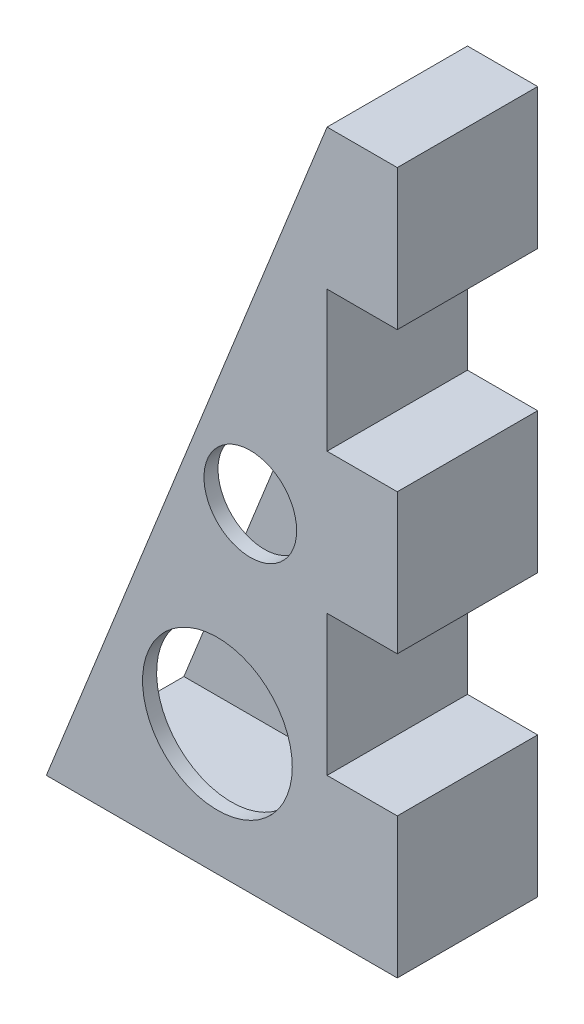
ISO-10303-21;
HEADER;
FILE_DESCRIPTION(('STEP AP214'),'2;1');
FILE_NAME('part.step','',(''),(''),'','','');
FILE_SCHEMA(('AUTOMOTIVE_DESIGN { 1 0 10303 214 1 1 1 1 }'));
ENDSEC;
DATA;
#1=APPLICATION_CONTEXT('core data for automotive mechanical design processes');
#2=APPLICATION_PROTOCOL_DEFINITION('international standard','automotive_design',2000,#1);
#3=PRODUCT_CONTEXT('',#1,'mechanical');
#4=PRODUCT('Part','Part','',(#3));
#5=PRODUCT_RELATED_PRODUCT_CATEGORY('part','',(#4));
#6=PRODUCT_DEFINITION_FORMATION('','',#4);
#7=PRODUCT_DEFINITION_CONTEXT('part definition',#1,'design');
#8=PRODUCT_DEFINITION('design','',#6,#7);
#9=PRODUCT_DEFINITION_SHAPE('','',#8);
#10=(LENGTH_UNIT() NAMED_UNIT(*) SI_UNIT(.MILLI.,.METRE.));
#11=(NAMED_UNIT(*) PLANE_ANGLE_UNIT() SI_UNIT($,.RADIAN.));
#12=(NAMED_UNIT(*) SI_UNIT($,.STERADIAN.) SOLID_ANGLE_UNIT());
#13=UNCERTAINTY_MEASURE_WITH_UNIT(LENGTH_MEASURE(1.E-05),#10,'distance_accuracy_value','');
#14=(GEOMETRIC_REPRESENTATION_CONTEXT(3) GLOBAL_UNCERTAINTY_ASSIGNED_CONTEXT((#13)) GLOBAL_UNIT_ASSIGNED_CONTEXT((#10,
#11,#12)) REPRESENTATION_CONTEXT('',''));
#15=CARTESIAN_POINT('',(0.,0.,0.));
#16=DIRECTION('',(0.,0.,1.));
#17=DIRECTION('',(1.,0.,0.));
#18=AXIS2_PLACEMENT_3D('',#15,#16,#17);
#19=CARTESIAN_POINT('',(15.8747982714616,-6.34991930858462,-10.));
#20=DIRECTION('',(-0.928476690885259,0.371390676354104,0.));
#21=DIRECTION('',(-0.371390676354104,-0.928476690885259,0.));
#22=AXIS2_PLACEMENT_3D('',#19,#20,#21);
#23=PLANE('',#22);
#24=DIRECTION('',(-0.371390676354104,-0.928476690885259,0.));
#25=VECTOR('',#24,1.);
#26=CARTESIAN_POINT('',(15.8747982714616,-6.34991930858462,0.));
#27=LINE('',#26,#25);
#28=CARTESIAN_POINT('',(38.4147659948954,50.,0.));
#29=VERTEX_POINT('',#28);
#30=CARTESIAN_POINT('',(18.4147659948954,0.,0.));
#31=VERTEX_POINT('',#30);
#32=EDGE_CURVE('E183',#29,#31,#27,.T.);
#33=ORIENTED_EDGE('',*,*,#32,.F.);
#34=DIRECTION('',(0.,0.,1.));
#35=VECTOR('',#34,1.);
#36=CARTESIAN_POINT('',(38.4147659948954,50.,-10.));
#37=LINE('',#36,#35);
#38=CARTESIAN_POINT('',(38.4147659948954,50.,-10.));
#39=VERTEX_POINT('',#38);
#40=EDGE_CURVE('E119',#39,#29,#37,.T.);
#41=ORIENTED_EDGE('',*,*,#40,.F.);
#42=DIRECTION('',(-0.371390676354104,-0.928476690885259,0.));
#43=VECTOR('',#42,1.);
#44=CARTESIAN_POINT('',(15.8747982714616,-6.34991930858462,-10.));
#45=LINE('',#44,#43);
#46=CARTESIAN_POINT('',(18.4147659948954,0.,-10.));
#47=VERTEX_POINT('',#46);
#48=EDGE_CURVE('E277',#39,#47,#45,.T.);
#49=ORIENTED_EDGE('',*,*,#48,.T.);
#50=DIRECTION('',(0.,0.,1.));
#51=VECTOR('',#50,1.);
#52=CARTESIAN_POINT('',(18.4147659948954,0.,-10.));
#53=LINE('',#52,#51);
#54=EDGE_CURVE('E230',#47,#31,#53,.T.);
#55=ORIENTED_EDGE('',*,*,#54,.T.);
#56=EDGE_LOOP('',(#33,#41,#49,#55));
#57=FACE_BOUND('',#56,.T.);
#58=DIRECTION('',(-0.371390676354104,-0.928476690885259,0.));
#59=VECTOR('',#58,1.);
#60=CARTESIAN_POINT('',(15.8747982714616,-6.34991930858462,-0.999999999999989));
#61=LINE('',#60,#59);
#62=CARTESIAN_POINT('',(36.4147659948954,45.,-0.99999999999999));
#63=VERTEX_POINT('',#62);
#64=CARTESIAN_POINT('',(19.2147659948954,2.,-0.99999999999999));
#65=VERTEX_POINT('',#64);
#66=EDGE_CURVE('E234',#63,#65,#61,.T.);
#67=ORIENTED_EDGE('',*,*,#66,.T.);
#68=DIRECTION('',(0.,0.,-1.));
#69=VECTOR('',#68,1.);
#70=CARTESIAN_POINT('',(19.2147659948954,2.,-10.));
#71=LINE('',#70,#69);
#72=CARTESIAN_POINT('',(19.2147659948954,2.,-9.00000000000001));
#73=VERTEX_POINT('',#72);
#74=EDGE_CURVE('E13',#65,#73,#71,.T.);
#75=ORIENTED_EDGE('',*,*,#74,.T.);
#76=DIRECTION('',(0.371390676354104,0.928476690885259,0.));
#77=VECTOR('',#76,1.);
#78=CARTESIAN_POINT('',(15.8747982714616,-6.34991930858462,-9.00000000000001));
#79=LINE('',#78,#77);
#80=CARTESIAN_POINT('',(36.4147659948954,45.,-9.));
#81=VERTEX_POINT('',#80);
#82=EDGE_CURVE('E51',#73,#81,#79,.T.);
#83=ORIENTED_EDGE('',*,*,#82,.T.);
#84=DIRECTION('',(0.,0.,-1.));
#85=VECTOR('',#84,1.);
#86=CARTESIAN_POINT('',(36.4147659948954,45.,-10.));
#87=LINE('',#86,#85);
#88=EDGE_CURVE('E215',#63,#81,#87,.T.);
#89=ORIENTED_EDGE('',*,*,#88,.F.);
#90=EDGE_LOOP('',(#67,#75,#83,#89));
#91=FACE_BOUND('',#90,.T.);
#92=ADVANCED_FACE('F42',(#57,#91),#23,.T.);
#93=CARTESIAN_POINT('',(0.,50.,-10.));
#94=DIRECTION('',(0.,1.,0.));
#95=DIRECTION('',(0.,0.,1.));
#96=AXIS2_PLACEMENT_3D('',#93,#94,#95);
#97=PLANE('',#96);
#98=DIRECTION('',(-1.,0.,0.));
#99=VECTOR('',#98,1.);
#100=CARTESIAN_POINT('',(0.,50.,0.));
#101=LINE('',#100,#99);
#102=CARTESIAN_POINT('',(43.4147659948954,50.,0.));
#103=VERTEX_POINT('',#102);
#104=EDGE_CURVE('E180',#103,#29,#101,.T.);
#105=ORIENTED_EDGE('',*,*,#104,.F.);
#106=DIRECTION('',(0.,0.,1.));
#107=VECTOR('',#106,1.);
#108=CARTESIAN_POINT('',(43.4147659948954,50.,-10.));
#109=LINE('',#108,#107);
#110=CARTESIAN_POINT('',(43.4147659948954,50.,-10.));
#111=VERTEX_POINT('',#110);
#112=EDGE_CURVE('E68',#111,#103,#109,.T.);
#113=ORIENTED_EDGE('',*,*,#112,.F.);
#114=DIRECTION('',(-1.,0.,0.));
#115=VECTOR('',#114,1.);
#116=CARTESIAN_POINT('',(0.,50.,-10.));
#117=LINE('',#116,#115);
#118=EDGE_CURVE('E213',#111,#39,#117,.T.);
#119=ORIENTED_EDGE('',*,*,#118,.T.);
#120=ORIENTED_EDGE('',*,*,#40,.T.);
#121=EDGE_LOOP('',(#105,#113,#119,#120));
#122=FACE_BOUND('',#121,.T.);
#123=ADVANCED_FACE('F44',(#122),#97,.T.);
#124=CARTESIAN_POINT('',(43.4147659948954,0.,-10.));
#125=DIRECTION('',(1.,0.,0.));
#126=DIRECTION('',(0.,0.,-1.));
#127=AXIS2_PLACEMENT_3D('',#124,#125,#126);
#128=PLANE('',#127);
#129=DIRECTION('',(0.,1.,0.));
#130=VECTOR('',#129,1.);
#131=CARTESIAN_POINT('',(43.4147659948954,0.,0.));
#132=LINE('',#131,#130);
#133=CARTESIAN_POINT('',(43.4147659948954,40.,0.));
#134=VERTEX_POINT('',#133);
#135=EDGE_CURVE('E210',#134,#103,#132,.T.);
#136=ORIENTED_EDGE('',*,*,#135,.F.);
#137=DIRECTION('',(0.,0.,1.));
#138=VECTOR('',#137,1.);
#139=CARTESIAN_POINT('',(43.4147659948954,40.,-10.));
#140=LINE('',#139,#138);
#141=CARTESIAN_POINT('',(43.4147659948954,40.,-10.));
#142=VERTEX_POINT('',#141);
#143=EDGE_CURVE('E161',#142,#134,#140,.T.);
#144=ORIENTED_EDGE('',*,*,#143,.F.);
#145=DIRECTION('',(0.,1.,0.));
#146=VECTOR('',#145,1.);
#147=CARTESIAN_POINT('',(43.4147659948954,0.,-10.));
#148=LINE('',#147,#146);
#149=EDGE_CURVE('E170',#142,#111,#148,.T.);
#150=ORIENTED_EDGE('',*,*,#149,.T.);
#151=ORIENTED_EDGE('',*,*,#112,.T.);
#152=EDGE_LOOP('',(#136,#144,#150,#151));
#153=FACE_BOUND('',#152,.T.);
#154=ADVANCED_FACE('F322',(#153),#128,.T.);
#155=CARTESIAN_POINT('',(0.,40.,-10.));
#156=DIRECTION('',(0.,-1.,0.));
#157=DIRECTION('',(0.,0.,-1.));
#158=AXIS2_PLACEMENT_3D('',#155,#156,#157);
#159=PLANE('',#158);
#160=DIRECTION('',(1.,0.,0.));
#161=VECTOR('',#160,1.);
#162=CARTESIAN_POINT('',(0.,40.,0.));
#163=LINE('',#162,#161);
#164=CARTESIAN_POINT('',(38.4147659948954,40.,0.));
#165=VERTEX_POINT('',#164);
#166=EDGE_CURVE('E156',#165,#134,#163,.T.);
#167=ORIENTED_EDGE('',*,*,#166,.F.);
#168=DIRECTION('',(0.,0.,1.));
#169=VECTOR('',#168,1.);
#170=CARTESIAN_POINT('',(38.4147659948954,40.,-10.));
#171=LINE('',#170,#169);
#172=CARTESIAN_POINT('',(38.4147659948954,40.,-10.));
#173=VERTEX_POINT('',#172);
#174=EDGE_CURVE('E150',#173,#165,#171,.T.);
#175=ORIENTED_EDGE('',*,*,#174,.F.);
#176=DIRECTION('',(1.,0.,0.));
#177=VECTOR('',#176,1.);
#178=CARTESIAN_POINT('',(0.,40.,-10.));
#179=LINE('',#178,#177);
#180=EDGE_CURVE('E153',#173,#142,#179,.T.);
#181=ORIENTED_EDGE('',*,*,#180,.T.);
#182=ORIENTED_EDGE('',*,*,#143,.T.);
#183=EDGE_LOOP('',(#167,#175,#181,#182));
#184=FACE_BOUND('',#183,.T.);
#185=ADVANCED_FACE('F152',(#184),#159,.T.);
#186=CARTESIAN_POINT('',(38.4147659948954,0.,-10.));
#187=DIRECTION('',(1.,0.,0.));
#188=DIRECTION('',(0.,1.,0.));
#189=AXIS2_PLACEMENT_3D('',#186,#187,#188);
#190=PLANE('',#189);
#191=DIRECTION('',(0.,1.,0.));
#192=VECTOR('',#191,1.);
#193=CARTESIAN_POINT('',(38.4147659948954,0.,0.));
#194=LINE('',#193,#192);
#195=CARTESIAN_POINT('',(38.4147659948954,30.,0.));
#196=VERTEX_POINT('',#195);
#197=EDGE_CURVE('E207',#196,#165,#194,.T.);
#198=ORIENTED_EDGE('',*,*,#197,.F.);
#199=DIRECTION('',(0.,0.,1.));
#200=VECTOR('',#199,1.);
#201=CARTESIAN_POINT('',(38.4147659948954,30.,-10.));
#202=LINE('',#201,#200);
#203=CARTESIAN_POINT('',(38.4147659948954,30.,-10.));
#204=VERTEX_POINT('',#203);
#205=EDGE_CURVE('E162',#204,#196,#202,.T.);
#206=ORIENTED_EDGE('',*,*,#205,.F.);
#207=DIRECTION('',(0.,1.,0.));
#208=VECTOR('',#207,1.);
#209=CARTESIAN_POINT('',(38.4147659948954,0.,-10.));
#210=LINE('',#209,#208);
#211=EDGE_CURVE('E168',#204,#173,#210,.T.);
#212=ORIENTED_EDGE('',*,*,#211,.T.);
#213=ORIENTED_EDGE('',*,*,#174,.T.);
#214=EDGE_LOOP('',(#198,#206,#212,#213));
#215=FACE_BOUND('',#214,.T.);
#216=ADVANCED_FACE('F172',(#215),#190,.T.);
#217=CARTESIAN_POINT('',(0.,30.,-10.));
#218=DIRECTION('',(0.,1.,0.));
#219=DIRECTION('',(0.,0.,1.));
#220=AXIS2_PLACEMENT_3D('',#217,#218,#219);
#221=PLANE('',#220);
#222=DIRECTION('',(-1.,0.,0.));
#223=VECTOR('',#222,1.);
#224=CARTESIAN_POINT('',(0.,30.,0.));
#225=LINE('',#224,#223);
#226=CARTESIAN_POINT('',(43.4147659948954,30.,0.));
#227=VERTEX_POINT('',#226);
#228=EDGE_CURVE('E204',#227,#196,#225,.T.);
#229=ORIENTED_EDGE('',*,*,#228,.F.);
#230=DIRECTION('',(0.,0.,1.));
#231=VECTOR('',#230,1.);
#232=CARTESIAN_POINT('',(43.4147659948954,30.,-10.));
#233=LINE('',#232,#231);
#234=CARTESIAN_POINT('',(43.4147659948954,30.,-10.));
#235=VERTEX_POINT('',#234);
#236=EDGE_CURVE('E218',#235,#227,#233,.T.);
#237=ORIENTED_EDGE('',*,*,#236,.F.);
#238=DIRECTION('',(-1.,0.,0.));
#239=VECTOR('',#238,1.);
#240=CARTESIAN_POINT('',(0.,30.,-10.));
#241=LINE('',#240,#239);
#242=EDGE_CURVE('E173',#235,#204,#241,.T.);
#243=ORIENTED_EDGE('',*,*,#242,.T.);
#244=ORIENTED_EDGE('',*,*,#205,.T.);
#245=EDGE_LOOP('',(#229,#237,#243,#244));
#246=FACE_BOUND('',#245,.T.);
#247=ADVANCED_FACE('F347',(#246),#221,.T.);
#248=CARTESIAN_POINT('',(43.4147659948954,0.,-10.));
#249=DIRECTION('',(1.,0.,0.));
#250=DIRECTION('',(0.,0.,-1.));
#251=AXIS2_PLACEMENT_3D('',#248,#249,#250);
#252=PLANE('',#251);
#253=DIRECTION('',(0.,1.,0.));
#254=VECTOR('',#253,1.);
#255=CARTESIAN_POINT('',(43.4147659948954,0.,0.));
#256=LINE('',#255,#254);
#257=CARTESIAN_POINT('',(43.4147659948954,20.,0.));
#258=VERTEX_POINT('',#257);
#259=EDGE_CURVE('E201',#258,#227,#256,.T.);
#260=ORIENTED_EDGE('',*,*,#259,.F.);
#261=DIRECTION('',(0.,0.,1.));
#262=VECTOR('',#261,1.);
#263=CARTESIAN_POINT('',(43.4147659948954,20.,-10.));
#264=LINE('',#263,#262);
#265=CARTESIAN_POINT('',(43.4147659948954,20.,-10.));
#266=VERTEX_POINT('',#265);
#267=EDGE_CURVE('E220',#266,#258,#264,.T.);
#268=ORIENTED_EDGE('',*,*,#267,.F.);
#269=DIRECTION('',(0.,1.,0.));
#270=VECTOR('',#269,1.);
#271=CARTESIAN_POINT('',(43.4147659948954,0.,-10.));
#272=LINE('',#271,#270);
#273=EDGE_CURVE('E175',#266,#235,#272,.T.);
#274=ORIENTED_EDGE('',*,*,#273,.T.);
#275=ORIENTED_EDGE('',*,*,#236,.T.);
#276=EDGE_LOOP('',(#260,#268,#274,#275));
#277=FACE_BOUND('',#276,.T.);
#278=ADVANCED_FACE('F297',(#277),#252,.T.);
#279=CARTESIAN_POINT('',(0.,20.,-10.));
#280=DIRECTION('',(0.,-1.,0.));
#281=DIRECTION('',(0.,0.,-1.));
#282=AXIS2_PLACEMENT_3D('',#279,#280,#281);
#283=PLANE('',#282);
#284=DIRECTION('',(1.,0.,0.));
#285=VECTOR('',#284,1.);
#286=CARTESIAN_POINT('',(0.,20.,0.));
#287=LINE('',#286,#285);
#288=CARTESIAN_POINT('',(38.4147659948954,20.,0.));
#289=VERTEX_POINT('',#288);
#290=EDGE_CURVE('E198',#289,#258,#287,.T.);
#291=ORIENTED_EDGE('',*,*,#290,.F.);
#292=DIRECTION('',(0.,0.,1.));
#293=VECTOR('',#292,1.);
#294=CARTESIAN_POINT('',(38.4147659948954,20.,-10.));
#295=LINE('',#294,#293);
#296=CARTESIAN_POINT('',(38.4147659948954,20.,-10.));
#297=VERTEX_POINT('',#296);
#298=EDGE_CURVE('E222',#297,#289,#295,.T.);
#299=ORIENTED_EDGE('',*,*,#298,.F.);
#300=DIRECTION('',(1.,0.,0.));
#301=VECTOR('',#300,1.);
#302=CARTESIAN_POINT('',(0.,20.,-10.));
#303=LINE('',#302,#301);
#304=EDGE_CURVE('E291',#297,#266,#303,.T.);
#305=ORIENTED_EDGE('',*,*,#304,.T.);
#306=ORIENTED_EDGE('',*,*,#267,.T.);
#307=EDGE_LOOP('',(#291,#299,#305,#306));
#308=FACE_BOUND('',#307,.T.);
#309=ADVANCED_FACE('F303',(#308),#283,.T.);
#310=CARTESIAN_POINT('',(38.4147659948954,0.,-10.));
#311=DIRECTION('',(1.,0.,0.));
#312=DIRECTION('',(0.,0.,-1.));
#313=AXIS2_PLACEMENT_3D('',#310,#311,#312);
#314=PLANE('',#313);
#315=DIRECTION('',(0.,1.,0.));
#316=VECTOR('',#315,1.);
#317=CARTESIAN_POINT('',(38.4147659948954,0.,0.));
#318=LINE('',#317,#316);
#319=CARTESIAN_POINT('',(38.4147659948954,10.,0.));
#320=VERTEX_POINT('',#319);
#321=EDGE_CURVE('E195',#320,#289,#318,.T.);
#322=ORIENTED_EDGE('',*,*,#321,.F.);
#323=DIRECTION('',(0.,0.,1.));
#324=VECTOR('',#323,1.);
#325=CARTESIAN_POINT('',(38.4147659948954,10.,-10.));
#326=LINE('',#325,#324);
#327=CARTESIAN_POINT('',(38.4147659948954,10.,-10.));
#328=VERTEX_POINT('',#327);
#329=EDGE_CURVE('E224',#328,#320,#326,.T.);
#330=ORIENTED_EDGE('',*,*,#329,.F.);
#331=DIRECTION('',(0.,1.,0.));
#332=VECTOR('',#331,1.);
#333=CARTESIAN_POINT('',(38.4147659948954,0.,-10.));
#334=LINE('',#333,#332);
#335=EDGE_CURVE('E288',#328,#297,#334,.T.);
#336=ORIENTED_EDGE('',*,*,#335,.T.);
#337=ORIENTED_EDGE('',*,*,#298,.T.);
#338=EDGE_LOOP('',(#322,#330,#336,#337));
#339=FACE_BOUND('',#338,.T.);
#340=ADVANCED_FACE('F306',(#339),#314,.T.);
#341=CARTESIAN_POINT('',(0.,9.99999999999997,-10.));
#342=DIRECTION('',(0.,1.,0.));
#343=DIRECTION('',(-1.,0.,0.));
#344=AXIS2_PLACEMENT_3D('',#341,#342,#343);
#345=PLANE('',#344);
#346=DIRECTION('',(-1.,0.,0.));
#347=VECTOR('',#346,1.);
#348=CARTESIAN_POINT('',(0.,9.99999999999997,0.));
#349=LINE('',#348,#347);
#350=CARTESIAN_POINT('',(43.4147659948954,10.,0.));
#351=VERTEX_POINT('',#350);
#352=EDGE_CURVE('E192',#351,#320,#349,.T.);
#353=ORIENTED_EDGE('',*,*,#352,.F.);
#354=DIRECTION('',(0.,0.,1.));
#355=VECTOR('',#354,1.);
#356=CARTESIAN_POINT('',(43.4147659948954,10.,-10.));
#357=LINE('',#356,#355);
#358=CARTESIAN_POINT('',(43.4147659948954,10.,-10.));
#359=VERTEX_POINT('',#358);
#360=EDGE_CURVE('E226',#359,#351,#357,.T.);
#361=ORIENTED_EDGE('',*,*,#360,.F.);
#362=DIRECTION('',(-1.,0.,0.));
#363=VECTOR('',#362,1.);
#364=CARTESIAN_POINT('',(0.,9.99999999999997,-10.));
#365=LINE('',#364,#363);
#366=EDGE_CURVE('E285',#359,#328,#365,.T.);
#367=ORIENTED_EDGE('',*,*,#366,.T.);
#368=ORIENTED_EDGE('',*,*,#329,.T.);
#369=EDGE_LOOP('',(#353,#361,#367,#368));
#370=FACE_BOUND('',#369,.T.);
#371=ADVANCED_FACE('F311',(#370),#345,.T.);
#372=CARTESIAN_POINT('',(43.4147659948954,0.,-10.));
#373=DIRECTION('',(1.,0.,0.));
#374=DIRECTION('',(0.,0.,-1.));
#375=AXIS2_PLACEMENT_3D('',#372,#373,#374);
#376=PLANE('',#375);
#377=DIRECTION('',(0.,1.,0.));
#378=VECTOR('',#377,1.);
#379=CARTESIAN_POINT('',(43.4147659948954,0.,0.));
#380=LINE('',#379,#378);
#381=CARTESIAN_POINT('',(43.4147659948954,0.,0.));
#382=VERTEX_POINT('',#381);
#383=EDGE_CURVE('E189',#382,#351,#380,.T.);
#384=ORIENTED_EDGE('',*,*,#383,.F.);
#385=DIRECTION('',(0.,0.,1.));
#386=VECTOR('',#385,1.);
#387=CARTESIAN_POINT('',(43.4147659948954,0.,-10.));
#388=LINE('',#387,#386);
#389=CARTESIAN_POINT('',(43.4147659948954,0.,-10.));
#390=VERTEX_POINT('',#389);
#391=EDGE_CURVE('E228',#390,#382,#388,.T.);
#392=ORIENTED_EDGE('',*,*,#391,.F.);
#393=DIRECTION('',(0.,1.,0.));
#394=VECTOR('',#393,1.);
#395=CARTESIAN_POINT('',(43.4147659948954,0.,-10.));
#396=LINE('',#395,#394);
#397=EDGE_CURVE('E282',#390,#359,#396,.T.);
#398=ORIENTED_EDGE('',*,*,#397,.T.);
#399=ORIENTED_EDGE('',*,*,#360,.T.);
#400=EDGE_LOOP('',(#384,#392,#398,#399));
#401=FACE_BOUND('',#400,.T.);
#402=ADVANCED_FACE('F314',(#401),#376,.T.);
#403=CARTESIAN_POINT('',(0.,0.,-10.));
#404=DIRECTION('',(0.,-1.,0.));
#405=DIRECTION('',(0.,0.,-1.));
#406=AXIS2_PLACEMENT_3D('',#403,#404,#405);
#407=PLANE('',#406);
#408=DIRECTION('',(1.,0.,0.));
#409=VECTOR('',#408,1.);
#410=CARTESIAN_POINT('',(0.,0.,0.));
#411=LINE('',#410,#409);
#412=EDGE_CURVE('E186',#31,#382,#411,.T.);
#413=ORIENTED_EDGE('',*,*,#412,.F.);
#414=ORIENTED_EDGE('',*,*,#54,.F.);
#415=DIRECTION('',(1.,0.,0.));
#416=VECTOR('',#415,1.);
#417=CARTESIAN_POINT('',(0.,0.,-10.));
#418=LINE('',#417,#416);
#419=EDGE_CURVE('E279',#47,#390,#418,.T.);
#420=ORIENTED_EDGE('',*,*,#419,.T.);
#421=ORIENTED_EDGE('',*,*,#391,.T.);
#422=EDGE_LOOP('',(#413,#414,#420,#421));
#423=FACE_BOUND('',#422,.T.);
#424=ADVANCED_FACE('F318',(#423),#407,.T.);
#425=CARTESIAN_POINT('',(0.,0.,-10.));
#426=DIRECTION('',(0.,0.,1.));
#427=DIRECTION('',(1.,0.,0.));
#428=AXIS2_PLACEMENT_3D('',#425,#426,#427);
#429=PLANE('',#428);
#430=CARTESIAN_POINT('',(30.6014471234954,9.27755535366764,-10.));
#431=DIRECTION('',(0.,0.,1.));
#432=DIRECTION('',(1.,0.,0.));
#433=AXIS2_PLACEMENT_3D('',#430,#431,#432);
#434=CIRCLE('',#433,5.33316353866673);
#435=CARTESIAN_POINT('',(35.9346106621621,9.27755535366764,-10.));
#436=VERTEX_POINT('',#435);
#437=EDGE_CURVE('E241',#436,#436,#434,.T.);
#438=ORIENTED_EDGE('',*,*,#437,.T.);
#439=EDGE_LOOP('',(#438));
#440=FACE_BOUND('',#439,.T.);
#441=CARTESIAN_POINT('',(32.9446824382619,24.0137122579652,-10.));
#442=DIRECTION('',(0.,0.,1.));
#443=DIRECTION('',(1.,0.,0.));
#444=AXIS2_PLACEMENT_3D('',#441,#442,#443);
#445=CIRCLE('',#444,3.30032870928411);
#446=CARTESIAN_POINT('',(36.245011147546,24.0137122579652,-10.));
#447=VERTEX_POINT('',#446);
#448=EDGE_CURVE('E257',#447,#447,#445,.T.);
#449=ORIENTED_EDGE('',*,*,#448,.T.);
#450=EDGE_LOOP('',(#449));
#451=FACE_BOUND('',#450,.T.);
#452=ORIENTED_EDGE('',*,*,#118,.F.);
#453=ORIENTED_EDGE('',*,*,#149,.F.);
#454=ORIENTED_EDGE('',*,*,#180,.F.);
#455=ORIENTED_EDGE('',*,*,#211,.F.);
#456=ORIENTED_EDGE('',*,*,#242,.F.);
#457=ORIENTED_EDGE('',*,*,#273,.F.);
#458=ORIENTED_EDGE('',*,*,#304,.F.);
#459=ORIENTED_EDGE('',*,*,#335,.F.);
#460=ORIENTED_EDGE('',*,*,#366,.F.);
#461=ORIENTED_EDGE('',*,*,#397,.F.);
#462=ORIENTED_EDGE('',*,*,#419,.F.);
#463=ORIENTED_EDGE('',*,*,#48,.F.);
#464=EDGE_LOOP('',(#452,#453,#454,#455,#456,#457,#458,#459,#460,#461,#462,#463));
#465=FACE_BOUND('',#464,.T.);
#466=ADVANCED_FACE('F166',(#440,#451,#465),#429,.F.);
#467=CARTESIAN_POINT('',(0.,0.,0.));
#468=DIRECTION('',(0.,0.,1.));
#469=DIRECTION('',(1.,0.,0.));
#470=AXIS2_PLACEMENT_3D('',#467,#468,#469);
#471=PLANE('',#470);
#472=CARTESIAN_POINT('',(30.6014471234954,9.27755535366764,0.));
#473=DIRECTION('',(0.,0.,1.));
#474=DIRECTION('',(1.,0.,0.));
#475=AXIS2_PLACEMENT_3D('',#472,#473,#474);
#476=CIRCLE('',#475,5.33316353866673);
#477=CARTESIAN_POINT('',(35.9346106621621,9.27755535366764,0.));
#478=VERTEX_POINT('',#477);
#479=EDGE_CURVE('E247',#478,#478,#476,.T.);
#480=ORIENTED_EDGE('',*,*,#479,.F.);
#481=EDGE_LOOP('',(#480));
#482=FACE_BOUND('',#481,.T.);
#483=CARTESIAN_POINT('',(32.9446824382619,24.0137122579652,0.));
#484=DIRECTION('',(0.,0.,1.));
#485=DIRECTION('',(1.,0.,0.));
#486=AXIS2_PLACEMENT_3D('',#483,#484,#485);
#487=CIRCLE('',#486,3.30032870928411);
#488=CARTESIAN_POINT('',(36.245011147546,24.0137122579652,0.));
#489=VERTEX_POINT('',#488);
#490=EDGE_CURVE('E252',#489,#489,#487,.T.);
#491=ORIENTED_EDGE('',*,*,#490,.F.);
#492=EDGE_LOOP('',(#491));
#493=FACE_BOUND('',#492,.T.);
#494=ORIENTED_EDGE('',*,*,#104,.T.);
#495=ORIENTED_EDGE('',*,*,#32,.T.);
#496=ORIENTED_EDGE('',*,*,#412,.T.);
#497=ORIENTED_EDGE('',*,*,#383,.T.);
#498=ORIENTED_EDGE('',*,*,#352,.T.);
#499=ORIENTED_EDGE('',*,*,#321,.T.);
#500=ORIENTED_EDGE('',*,*,#290,.T.);
#501=ORIENTED_EDGE('',*,*,#259,.T.);
#502=ORIENTED_EDGE('',*,*,#228,.T.);
#503=ORIENTED_EDGE('',*,*,#197,.T.);
#504=ORIENTED_EDGE('',*,*,#166,.T.);
#505=ORIENTED_EDGE('',*,*,#135,.T.);
#506=EDGE_LOOP('',(#494,#495,#496,#497,#498,#499,#500,#501,#502,#503,#504,#505));
#507=FACE_BOUND('',#506,.T.);
#508=ADVANCED_FACE('F321',(#482,#493,#507),#471,.T.);
#509=CARTESIAN_POINT('',(87.0768662372812,50.,-9.));
#510=DIRECTION('',(0.,0.,1.));
#511=DIRECTION('',(0.,-1.,0.));
#512=AXIS2_PLACEMENT_3D('',#509,#510,#511);
#513=PLANE('',#512);
#514=CARTESIAN_POINT('',(30.6014471234954,9.27755535366764,-9.00000000000001));
#515=DIRECTION('',(0.,0.,1.));
#516=DIRECTION('',(0.,-1.,0.));
#517=AXIS2_PLACEMENT_3D('',#514,#515,#516);
#518=CIRCLE('',#517,5.33316353866673);
#519=CARTESIAN_POINT('',(30.6014471234954,3.94439181500091,-9.00000000000001));
#520=VERTEX_POINT('',#519);
#521=EDGE_CURVE('E260',#520,#520,#518,.T.);
#522=ORIENTED_EDGE('',*,*,#521,.F.);
#523=EDGE_LOOP('',(#522));
#524=FACE_BOUND('',#523,.T.);
#525=CARTESIAN_POINT('',(32.9446824382619,24.0137122579652,-9.00000000000001));
#526=DIRECTION('',(0.,0.,1.));
#527=DIRECTION('',(0.,-1.,0.));
#528=AXIS2_PLACEMENT_3D('',#525,#526,#527);
#529=CIRCLE('',#528,3.30032870928411);
#530=CARTESIAN_POINT('',(32.9446824382619,20.7133835486811,-9.00000000000001));
#531=VERTEX_POINT('',#530);
#532=EDGE_CURVE('E240',#531,#531,#529,.T.);
#533=ORIENTED_EDGE('',*,*,#532,.F.);
#534=EDGE_LOOP('',(#533));
#535=FACE_BOUND('',#534,.T.);
#536=DIRECTION('',(-1.,0.,0.));
#537=VECTOR('',#536,1.);
#538=CARTESIAN_POINT('',(87.0768662372812,2.,-9.00000000000001));
#539=LINE('',#538,#537);
#540=CARTESIAN_POINT('',(36.4147659948954,2.,-9.00000000000001));
#541=VERTEX_POINT('',#540);
#542=EDGE_CURVE('E263',#541,#73,#539,.T.);
#543=ORIENTED_EDGE('',*,*,#542,.F.);
#544=DIRECTION('',(0.,1.,0.));
#545=VECTOR('',#544,1.);
#546=CARTESIAN_POINT('',(36.4147659948954,50.,-9.));
#547=LINE('',#546,#545);
#548=EDGE_CURVE('E265',#541,#81,#547,.T.);
#549=ORIENTED_EDGE('',*,*,#548,.T.);
#550=ORIENTED_EDGE('',*,*,#82,.F.);
#551=EDGE_LOOP('',(#543,#549,#550));
#552=FACE_BOUND('',#551,.T.);
#553=ADVANCED_FACE('F397',(#524,#535,#552),#513,.T.);
#554=CARTESIAN_POINT('',(87.0768662372812,50.,-0.999999999999999));
#555=DIRECTION('',(0.,0.,-1.));
#556=DIRECTION('',(0.,1.,0.));
#557=AXIS2_PLACEMENT_3D('',#554,#555,#556);
#558=PLANE('',#557);
#559=CARTESIAN_POINT('',(30.6014471234954,9.27755535366764,-0.999999999999992));
#560=DIRECTION('',(0.,0.,-1.));
#561=DIRECTION('',(0.,1.,0.));
#562=AXIS2_PLACEMENT_3D('',#559,#560,#561);
#563=CIRCLE('',#562,5.33316353866673);
#564=CARTESIAN_POINT('',(30.6014471234954,14.6107188923344,-0.999999999999993));
#565=VERTEX_POINT('',#564);
#566=EDGE_CURVE('E46',#565,#565,#563,.T.);
#567=ORIENTED_EDGE('',*,*,#566,.F.);
#568=EDGE_LOOP('',(#567));
#569=FACE_BOUND('',#568,.T.);
#570=CARTESIAN_POINT('',(32.9446824382619,24.0137122579652,-0.999999999999994));
#571=DIRECTION('',(0.,0.,-1.));
#572=DIRECTION('',(0.,1.,0.));
#573=AXIS2_PLACEMENT_3D('',#570,#571,#572);
#574=CIRCLE('',#573,3.30032870928411);
#575=CARTESIAN_POINT('',(32.9446824382619,27.3140409672494,-0.999999999999995));
#576=VERTEX_POINT('',#575);
#577=EDGE_CURVE('E238',#576,#576,#574,.T.);
#578=ORIENTED_EDGE('',*,*,#577,.F.);
#579=EDGE_LOOP('',(#578));
#580=FACE_BOUND('',#579,.T.);
#581=DIRECTION('',(0.,-1.,0.));
#582=VECTOR('',#581,1.);
#583=CARTESIAN_POINT('',(36.4147659948954,50.,-0.999999999999999));
#584=LINE('',#583,#582);
#585=CARTESIAN_POINT('',(36.4147659948954,2.,-0.99999999999999));
#586=VERTEX_POINT('',#585);
#587=EDGE_CURVE('E59',#63,#586,#584,.T.);
#588=ORIENTED_EDGE('',*,*,#587,.T.);
#589=DIRECTION('',(-1.,0.,0.));
#590=VECTOR('',#589,1.);
#591=CARTESIAN_POINT('',(87.0768662372812,2.,-0.99999999999999));
#592=LINE('',#591,#590);
#593=EDGE_CURVE('E271',#586,#65,#592,.T.);
#594=ORIENTED_EDGE('',*,*,#593,.T.);
#595=ORIENTED_EDGE('',*,*,#66,.F.);
#596=EDGE_LOOP('',(#588,#594,#595));
#597=FACE_BOUND('',#596,.T.);
#598=ADVANCED_FACE('F404',(#569,#580,#597),#558,.T.);
#599=CARTESIAN_POINT('',(87.0768662372812,2.,-9.00000000000001));
#600=DIRECTION('',(0.,1.,0.));
#601=DIRECTION('',(0.,0.,1.));
#602=AXIS2_PLACEMENT_3D('',#599,#600,#601);
#603=PLANE('',#602);
#604=ORIENTED_EDGE('',*,*,#593,.F.);
#605=DIRECTION('',(0.,0.,-1.));
#606=VECTOR('',#605,1.);
#607=CARTESIAN_POINT('',(36.4147659948954,2.,-9.00000000000001));
#608=LINE('',#607,#606);
#609=EDGE_CURVE('E268',#586,#541,#608,.T.);
#610=ORIENTED_EDGE('',*,*,#609,.T.);
#611=ORIENTED_EDGE('',*,*,#542,.T.);
#612=ORIENTED_EDGE('',*,*,#74,.F.);
#613=EDGE_LOOP('',(#604,#610,#611,#612));
#614=FACE_BOUND('',#613,.T.);
#615=ADVANCED_FACE('F412',(#614),#603,.T.);
#616=CARTESIAN_POINT('',(36.4147659948954,0.,-10.));
#617=DIRECTION('',(1.,0.,0.));
#618=DIRECTION('',(0.,0.,-1.));
#619=AXIS2_PLACEMENT_3D('',#616,#617,#618);
#620=PLANE('',#619);
#621=ORIENTED_EDGE('',*,*,#88,.T.);
#622=ORIENTED_EDGE('',*,*,#548,.F.);
#623=ORIENTED_EDGE('',*,*,#609,.F.);
#624=ORIENTED_EDGE('',*,*,#587,.F.);
#625=EDGE_LOOP('',(#621,#622,#623,#624));
#626=FACE_BOUND('',#625,.T.);
#627=ADVANCED_FACE('F421',(#626),#620,.F.);
#628=CARTESIAN_POINT('',(32.9446824382619,24.0137122579652,-10.));
#629=DIRECTION('',(0.,0.,1.));
#630=DIRECTION('',(1.,0.,0.));
#631=AXIS2_PLACEMENT_3D('',#628,#629,#630);
#632=CYLINDRICAL_SURFACE('',#631,3.30032870928411);
#633=ORIENTED_EDGE('',*,*,#577,.T.);
#634=EDGE_LOOP('',(#633));
#635=FACE_BOUND('',#634,.T.);
#636=ORIENTED_EDGE('',*,*,#490,.T.);
#637=EDGE_LOOP('',(#636));
#638=FACE_BOUND('',#637,.T.);
#639=ADVANCED_FACE('F428',(#635,#638),#632,.F.);
#640=CARTESIAN_POINT('',(30.6014471234954,9.27755535366764,-10.));
#641=DIRECTION('',(0.,0.,1.));
#642=DIRECTION('',(1.,0.,0.));
#643=AXIS2_PLACEMENT_3D('',#640,#641,#642);
#644=CYLINDRICAL_SURFACE('',#643,5.33316353866673);
#645=ORIENTED_EDGE('',*,*,#566,.T.);
#646=EDGE_LOOP('',(#645));
#647=FACE_BOUND('',#646,.T.);
#648=ORIENTED_EDGE('',*,*,#479,.T.);
#649=EDGE_LOOP('',(#648));
#650=FACE_BOUND('',#649,.T.);
#651=ADVANCED_FACE('F434',(#647,#650),#644,.F.);
#652=ORIENTED_EDGE('',*,*,#532,.T.);
#653=EDGE_LOOP('',(#652));
#654=FACE_BOUND('',#653,.T.);
#655=ORIENTED_EDGE('',*,*,#448,.F.);
#656=EDGE_LOOP('',(#655));
#657=FACE_BOUND('',#656,.T.);
#658=ADVANCED_FACE('F436',(#654,#657),#632,.F.);
#659=ORIENTED_EDGE('',*,*,#521,.T.);
#660=EDGE_LOOP('',(#659));
#661=FACE_BOUND('',#660,.T.);
#662=ORIENTED_EDGE('',*,*,#437,.F.);
#663=EDGE_LOOP('',(#662));
#664=FACE_BOUND('',#663,.T.);
#665=ADVANCED_FACE('F444',(#661,#664),#644,.F.);
#666=CLOSED_SHELL('',(#92,#123,#154,#185,#216,#247,#278,#309,#340,#371,#402,#424,#466,#508,#553,
#598,#615,#627,#639,#651,#658,#665));
#667=MANIFOLD_SOLID_BREP('B2',#666);
#668=ADVANCED_BREP_SHAPE_REPRESENTATION('',(#18,#667),#14);
#669=SHAPE_DEFINITION_REPRESENTATION(#9,#668);
ENDSEC;
END-ISO-10303-21;
